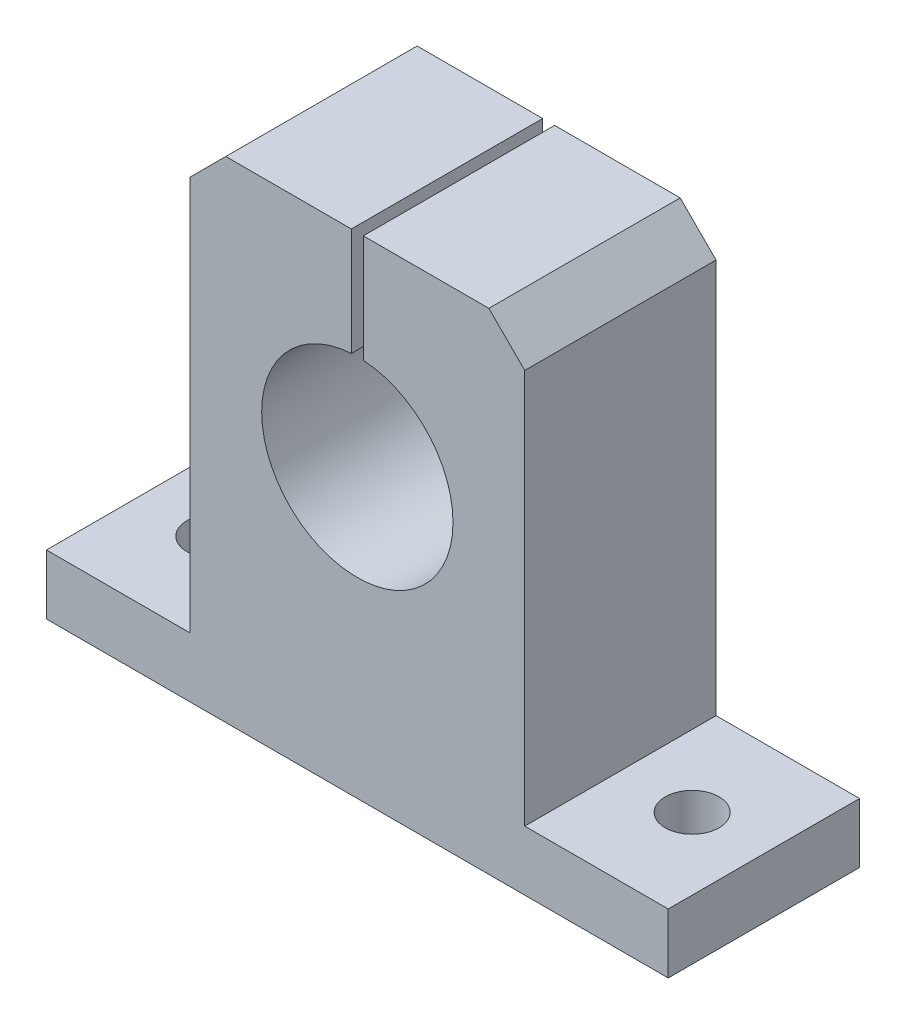
ISO-10303-21;
HEADER;
FILE_DESCRIPTION(('STEP AP214'),'2;1');
FILE_NAME('part.step','',(''),(''),'','','');
FILE_SCHEMA(('AUTOMOTIVE_DESIGN { 1 0 10303 214 1 1 1 1 }'));
ENDSEC;
DATA;
#1=APPLICATION_CONTEXT('core data for automotive mechanical design processes');
#2=APPLICATION_PROTOCOL_DEFINITION('international standard','automotive_design',2000,#1);
#3=PRODUCT_CONTEXT('',#1,'mechanical');
#4=PRODUCT('Part','Part','',(#3));
#5=PRODUCT_RELATED_PRODUCT_CATEGORY('part','',(#4));
#6=PRODUCT_DEFINITION_FORMATION('','',#4);
#7=PRODUCT_DEFINITION_CONTEXT('part definition',#1,'design');
#8=PRODUCT_DEFINITION('design','',#6,#7);
#9=PRODUCT_DEFINITION_SHAPE('','',#8);
#10=(LENGTH_UNIT() NAMED_UNIT(*) SI_UNIT(.MILLI.,.METRE.));
#11=(NAMED_UNIT(*) PLANE_ANGLE_UNIT() SI_UNIT($,.RADIAN.));
#12=(NAMED_UNIT(*) SI_UNIT($,.STERADIAN.) SOLID_ANGLE_UNIT());
#13=UNCERTAINTY_MEASURE_WITH_UNIT(LENGTH_MEASURE(1.E-05),#10,'distance_accuracy_value','');
#14=(GEOMETRIC_REPRESENTATION_CONTEXT(3) GLOBAL_UNCERTAINTY_ASSIGNED_CONTEXT((#13)) GLOBAL_UNIT_ASSIGNED_CONTEXT((#10,
#11,#12)) REPRESENTATION_CONTEXT('',''));
#15=CARTESIAN_POINT('',(0.,0.,0.));
#16=DIRECTION('',(0.,0.,1.));
#17=DIRECTION('',(1.,0.,0.));
#18=AXIS2_PLACEMENT_3D('',#15,#16,#17);
#19=CARTESIAN_POINT('',(41.275,-38.1,12.7));
#20=DIRECTION('',(0.,1.,0.));
#21=DIRECTION('',(-1.,0.,0.));
#22=AXIS2_PLACEMENT_3D('',#19,#20,#21);
#23=PLANE('',#22);
#24=DIRECTION('',(1.,0.,0.));
#25=VECTOR('',#24,1.);
#26=CARTESIAN_POINT('',(41.275,-38.1,-12.7));
#27=LINE('',#26,#25);
#28=CARTESIAN_POINT('',(-41.275,-38.1,-12.7));
#29=VERTEX_POINT('',#28);
#30=CARTESIAN_POINT('',(41.275,-38.1,-12.7));
#31=VERTEX_POINT('',#30);
#32=EDGE_CURVE('E170',#29,#31,#27,.T.);
#33=ORIENTED_EDGE('',*,*,#32,.T.);
#34=DIRECTION('',(0.,0.,-1.));
#35=VECTOR('',#34,1.);
#36=CARTESIAN_POINT('',(41.275,-38.1,12.7));
#37=LINE('',#36,#35);
#38=CARTESIAN_POINT('',(41.275,-38.1,12.7));
#39=VERTEX_POINT('',#38);
#40=EDGE_CURVE('E206',#39,#31,#37,.T.);
#41=ORIENTED_EDGE('',*,*,#40,.F.);
#42=DIRECTION('',(1.,0.,0.));
#43=VECTOR('',#42,1.);
#44=CARTESIAN_POINT('',(41.275,-38.1,12.7));
#45=LINE('',#44,#43);
#46=CARTESIAN_POINT('',(-41.275,-38.1,12.7));
#47=VERTEX_POINT('',#46);
#48=EDGE_CURVE('E194',#47,#39,#45,.T.);
#49=ORIENTED_EDGE('',*,*,#48,.F.);
#50=DIRECTION('',(0.,0.,-1.));
#51=VECTOR('',#50,1.);
#52=CARTESIAN_POINT('',(-41.275,-38.1,12.7));
#53=LINE('',#52,#51);
#54=EDGE_CURVE('E209',#47,#29,#53,.T.);
#55=ORIENTED_EDGE('',*,*,#54,.T.);
#56=EDGE_LOOP('',(#33,#41,#49,#55));
#57=FACE_BOUND('',#56,.T.);
#58=CARTESIAN_POINT('',(31.75,-38.1,0.));
#59=DIRECTION('',(0.,-1.,0.));
#60=DIRECTION('',(0.,0.,-1.));
#61=AXIS2_PLACEMENT_3D('',#58,#59,#60);
#62=CIRCLE('',#61,3.57124);
#63=CARTESIAN_POINT('',(31.75,-38.1,-3.57124));
#64=VERTEX_POINT('',#63);
#65=EDGE_CURVE('E266',#64,#64,#62,.T.);
#66=ORIENTED_EDGE('',*,*,#65,.F.);
#67=EDGE_LOOP('',(#66));
#68=FACE_BOUND('',#67,.T.);
#69=CARTESIAN_POINT('',(-31.75,-38.1,0.));
#70=DIRECTION('',(0.,-1.,0.));
#71=DIRECTION('',(0.,0.,-1.));
#72=AXIS2_PLACEMENT_3D('',#69,#70,#71);
#73=CIRCLE('',#72,3.57124);
#74=CARTESIAN_POINT('',(-31.75,-38.1,-3.57124));
#75=VERTEX_POINT('',#74);
#76=EDGE_CURVE('E274',#75,#75,#73,.T.);
#77=ORIENTED_EDGE('',*,*,#76,.F.);
#78=EDGE_LOOP('',(#77));
#79=FACE_BOUND('',#78,.T.);
#80=ADVANCED_FACE('F29',(#57,#68,#79),#23,.F.);
#81=CARTESIAN_POINT('',(22.225,26.9875,12.7));
#82=DIRECTION('',(-1.,0.,0.));
#83=DIRECTION('',(0.,-1.,0.));
#84=AXIS2_PLACEMENT_3D('',#81,#82,#83);
#85=PLANE('',#84);
#86=DIRECTION('',(0.,1.,0.));
#87=VECTOR('',#86,1.);
#88=CARTESIAN_POINT('',(22.225,26.9875,-12.7));
#89=LINE('',#88,#87);
#90=CARTESIAN_POINT('',(22.225,-30.1625,-12.7));
#91=VERTEX_POINT('',#90);
#92=CARTESIAN_POINT('',(22.225,22.225,-12.7));
#93=VERTEX_POINT('',#92);
#94=EDGE_CURVE('E140',#91,#93,#89,.T.);
#95=ORIENTED_EDGE('',*,*,#94,.T.);
#96=DIRECTION('',(0.,0.,1.));
#97=VECTOR('',#96,1.);
#98=CARTESIAN_POINT('',(22.225,22.225,12.7));
#99=LINE('',#98,#97);
#100=CARTESIAN_POINT('',(22.225,22.225,12.7));
#101=VERTEX_POINT('',#100);
#102=EDGE_CURVE('E11',#93,#101,#99,.T.);
#103=ORIENTED_EDGE('',*,*,#102,.T.);
#104=DIRECTION('',(0.,1.,0.));
#105=VECTOR('',#104,1.);
#106=CARTESIAN_POINT('',(22.225,26.9875,12.7));
#107=LINE('',#106,#105);
#108=CARTESIAN_POINT('',(22.225,-30.1625,12.7));
#109=VERTEX_POINT('',#108);
#110=EDGE_CURVE('E176',#109,#101,#107,.T.);
#111=ORIENTED_EDGE('',*,*,#110,.F.);
#112=DIRECTION('',(0.,0.,-1.));
#113=VECTOR('',#112,1.);
#114=CARTESIAN_POINT('',(22.225,-30.1625,12.7));
#115=LINE('',#114,#113);
#116=EDGE_CURVE('E200',#109,#91,#115,.T.);
#117=ORIENTED_EDGE('',*,*,#116,.T.);
#118=EDGE_LOOP('',(#95,#103,#111,#117));
#119=FACE_BOUND('',#118,.T.);
#120=ADVANCED_FACE('F31',(#119),#85,.F.);
#121=CARTESIAN_POINT('',(22.225,26.9875,12.7));
#122=DIRECTION('',(0.,-1.,0.));
#123=DIRECTION('',(0.,0.,-1.));
#124=AXIS2_PLACEMENT_3D('',#121,#122,#123);
#125=PLANE('',#124);
#126=DIRECTION('',(-1.,0.,0.));
#127=VECTOR('',#126,1.);
#128=CARTESIAN_POINT('',(22.225,26.9875,12.7));
#129=LINE('',#128,#127);
#130=CARTESIAN_POINT('',(17.4625,26.9875,12.7));
#131=VERTEX_POINT('',#130);
#132=CARTESIAN_POINT('',(0.793750000000026,26.9875,12.7));
#133=VERTEX_POINT('',#132);
#134=EDGE_CURVE('E178',#131,#133,#129,.T.);
#135=ORIENTED_EDGE('',*,*,#134,.F.);
#136=DIRECTION('',(0.,0.,-1.));
#137=VECTOR('',#136,1.);
#138=CARTESIAN_POINT('',(17.4625,26.9875,12.7));
#139=LINE('',#138,#137);
#140=CARTESIAN_POINT('',(17.4625,26.9875,-12.7));
#141=VERTEX_POINT('',#140);
#142=EDGE_CURVE('E37',#131,#141,#139,.T.);
#143=ORIENTED_EDGE('',*,*,#142,.T.);
#144=DIRECTION('',(-1.,0.,0.));
#145=VECTOR('',#144,1.);
#146=CARTESIAN_POINT('',(22.225,26.9875,-12.7));
#147=LINE('',#146,#145);
#148=CARTESIAN_POINT('',(0.793750000000026,26.9875,-12.7));
#149=VERTEX_POINT('',#148);
#150=EDGE_CURVE('E131',#141,#149,#147,.T.);
#151=ORIENTED_EDGE('',*,*,#150,.T.);
#152=DIRECTION('',(0.,0.,-1.));
#153=VECTOR('',#152,1.);
#154=CARTESIAN_POINT('',(0.793750000000026,26.9875,12.7));
#155=LINE('',#154,#153);
#156=EDGE_CURVE('E134',#133,#149,#155,.T.);
#157=ORIENTED_EDGE('',*,*,#156,.F.);
#158=EDGE_LOOP('',(#135,#143,#151,#157));
#159=FACE_BOUND('',#158,.T.);
#160=ADVANCED_FACE('F133',(#159),#125,.F.);
#161=CARTESIAN_POINT('',(0.793750000000026,26.9875,12.7));
#162=DIRECTION('',(1.,0.,0.));
#163=DIRECTION('',(0.,0.,-1.));
#164=AXIS2_PLACEMENT_3D('',#161,#162,#163);
#165=PLANE('',#164);
#166=DIRECTION('',(0.,-1.,0.));
#167=VECTOR('',#166,1.);
#168=CARTESIAN_POINT('',(0.793750000000026,26.9875,-12.7));
#169=LINE('',#168,#167);
#170=CARTESIAN_POINT('',(0.793750000000026,12.6751710417454,-12.7));
#171=VERTEX_POINT('',#170);
#172=EDGE_CURVE('E139',#149,#171,#169,.T.);
#173=ORIENTED_EDGE('',*,*,#172,.T.);
#174=DIRECTION('',(0.,0.,-1.));
#175=VECTOR('',#174,1.);
#176=CARTESIAN_POINT('',(0.793750000000026,12.6751710417454,12.7));
#177=LINE('',#176,#175);
#178=CARTESIAN_POINT('',(0.793750000000026,12.6751710417454,12.7));
#179=VERTEX_POINT('',#178);
#180=EDGE_CURVE('E148',#179,#171,#177,.T.);
#181=ORIENTED_EDGE('',*,*,#180,.F.);
#182=DIRECTION('',(0.,-1.,0.));
#183=VECTOR('',#182,1.);
#184=CARTESIAN_POINT('',(0.793750000000026,26.9875,12.7));
#185=LINE('',#184,#183);
#186=EDGE_CURVE('E146',#133,#179,#185,.T.);
#187=ORIENTED_EDGE('',*,*,#186,.F.);
#188=ORIENTED_EDGE('',*,*,#156,.T.);
#189=EDGE_LOOP('',(#173,#181,#187,#188));
#190=FACE_BOUND('',#189,.T.);
#191=ADVANCED_FACE('F143',(#190),#165,.F.);
#192=CARTESIAN_POINT('',(0.,0.,12.7));
#193=DIRECTION('',(0.,0.,-1.));
#194=DIRECTION('',(-1.,0.,0.));
#195=AXIS2_PLACEMENT_3D('',#192,#193,#194);
#196=CYLINDRICAL_SURFACE('',#195,12.7);
#197=CARTESIAN_POINT('',(0.,0.,-12.7));
#198=DIRECTION('',(0.,0.,-1.));
#199=DIRECTION('',(1.,0.,0.));
#200=AXIS2_PLACEMENT_3D('',#197,#198,#199);
#201=CIRCLE('',#200,12.7);
#202=CARTESIAN_POINT('',(-0.793749999999972,12.6751710417454,-12.7));
#203=VERTEX_POINT('',#202);
#204=EDGE_CURVE('E154',#171,#203,#201,.T.);
#205=ORIENTED_EDGE('',*,*,#204,.T.);
#206=DIRECTION('',(0.,0.,-1.));
#207=VECTOR('',#206,1.);
#208=CARTESIAN_POINT('',(-0.793749999999972,12.6751710417454,12.7));
#209=LINE('',#208,#207);
#210=CARTESIAN_POINT('',(-0.793749999999972,12.6751710417454,12.7));
#211=VERTEX_POINT('',#210);
#212=EDGE_CURVE('E221',#211,#203,#209,.T.);
#213=ORIENTED_EDGE('',*,*,#212,.F.);
#214=CARTESIAN_POINT('',(0.,0.,12.7));
#215=DIRECTION('',(0.,0.,-1.));
#216=DIRECTION('',(1.,0.,0.));
#217=AXIS2_PLACEMENT_3D('',#214,#215,#216);
#218=CIRCLE('',#217,12.7);
#219=EDGE_CURVE('E181',#179,#211,#218,.T.);
#220=ORIENTED_EDGE('',*,*,#219,.F.);
#221=ORIENTED_EDGE('',*,*,#180,.T.);
#222=EDGE_LOOP('',(#205,#213,#220,#221));
#223=FACE_BOUND('',#222,.T.);
#224=ADVANCED_FACE('F258',(#223),#196,.F.);
#225=CARTESIAN_POINT('',(-0.793749999999973,26.9875,12.7));
#226=DIRECTION('',(-1.,0.,0.));
#227=DIRECTION('',(0.,0.,1.));
#228=AXIS2_PLACEMENT_3D('',#225,#226,#227);
#229=PLANE('',#228);
#230=DIRECTION('',(0.,1.,0.));
#231=VECTOR('',#230,1.);
#232=CARTESIAN_POINT('',(-0.793749999999973,26.9875,-12.7));
#233=LINE('',#232,#231);
#234=CARTESIAN_POINT('',(-0.793749999999973,26.9875,-12.7));
#235=VERTEX_POINT('',#234);
#236=EDGE_CURVE('E156',#203,#235,#233,.T.);
#237=ORIENTED_EDGE('',*,*,#236,.T.);
#238=DIRECTION('',(0.,0.,-1.));
#239=VECTOR('',#238,1.);
#240=CARTESIAN_POINT('',(-0.793749999999973,26.9875,12.7));
#241=LINE('',#240,#239);
#242=CARTESIAN_POINT('',(-0.793749999999973,26.9875,12.7));
#243=VERTEX_POINT('',#242);
#244=EDGE_CURVE('E218',#243,#235,#241,.T.);
#245=ORIENTED_EDGE('',*,*,#244,.F.);
#246=DIRECTION('',(0.,1.,0.));
#247=VECTOR('',#246,1.);
#248=CARTESIAN_POINT('',(-0.793749999999973,26.9875,12.7));
#249=LINE('',#248,#247);
#250=EDGE_CURVE('E183',#211,#243,#249,.T.);
#251=ORIENTED_EDGE('',*,*,#250,.F.);
#252=ORIENTED_EDGE('',*,*,#212,.T.);
#253=EDGE_LOOP('',(#237,#245,#251,#252));
#254=FACE_BOUND('',#253,.T.);
#255=ADVANCED_FACE('F254',(#254),#229,.F.);
#256=CARTESIAN_POINT('',(-22.225,26.9875,12.7));
#257=DIRECTION('',(0.,-1.,0.));
#258=DIRECTION('',(0.,0.,-1.));
#259=AXIS2_PLACEMENT_3D('',#256,#257,#258);
#260=PLANE('',#259);
#261=DIRECTION('',(-1.,0.,0.));
#262=VECTOR('',#261,1.);
#263=CARTESIAN_POINT('',(-22.225,26.9875,-12.7));
#264=LINE('',#263,#262);
#265=CARTESIAN_POINT('',(-17.4625,26.9875,-12.7));
#266=VERTEX_POINT('',#265);
#267=EDGE_CURVE('E161',#235,#266,#264,.T.);
#268=ORIENTED_EDGE('',*,*,#267,.T.);
#269=DIRECTION('',(0.,0.,1.));
#270=VECTOR('',#269,1.);
#271=CARTESIAN_POINT('',(-17.4625,26.9875,12.7));
#272=LINE('',#271,#270);
#273=CARTESIAN_POINT('',(-17.4625,26.9875,12.7));
#274=VERTEX_POINT('',#273);
#275=EDGE_CURVE('E231',#266,#274,#272,.T.);
#276=ORIENTED_EDGE('',*,*,#275,.T.);
#277=DIRECTION('',(-1.,0.,0.));
#278=VECTOR('',#277,1.);
#279=CARTESIAN_POINT('',(-22.225,26.9875,12.7));
#280=LINE('',#279,#278);
#281=EDGE_CURVE('E185',#243,#274,#280,.T.);
#282=ORIENTED_EDGE('',*,*,#281,.F.);
#283=ORIENTED_EDGE('',*,*,#244,.T.);
#284=EDGE_LOOP('',(#268,#276,#282,#283));
#285=FACE_BOUND('',#284,.T.);
#286=ADVANCED_FACE('F250',(#285),#260,.F.);
#287=CARTESIAN_POINT('',(-22.225,-30.1625,12.7));
#288=DIRECTION('',(1.,0.,0.));
#289=DIRECTION('',(0.,1.,0.));
#290=AXIS2_PLACEMENT_3D('',#287,#288,#289);
#291=PLANE('',#290);
#292=DIRECTION('',(0.,-1.,0.));
#293=VECTOR('',#292,1.);
#294=CARTESIAN_POINT('',(-22.225,-30.1625,12.7));
#295=LINE('',#294,#293);
#296=CARTESIAN_POINT('',(-22.225,22.225,12.7));
#297=VERTEX_POINT('',#296);
#298=CARTESIAN_POINT('',(-22.225,-30.1625,12.7));
#299=VERTEX_POINT('',#298);
#300=EDGE_CURVE('E188',#297,#299,#295,.T.);
#301=ORIENTED_EDGE('',*,*,#300,.F.);
#302=DIRECTION('',(0.,0.,-1.));
#303=VECTOR('',#302,1.);
#304=CARTESIAN_POINT('',(-22.225,22.225,12.7));
#305=LINE('',#304,#303);
#306=CARTESIAN_POINT('',(-22.225,22.225,-12.7));
#307=VERTEX_POINT('',#306);
#308=EDGE_CURVE('E147',#297,#307,#305,.T.);
#309=ORIENTED_EDGE('',*,*,#308,.T.);
#310=DIRECTION('',(0.,-1.,0.));
#311=VECTOR('',#310,1.);
#312=CARTESIAN_POINT('',(-22.225,-30.1625,-12.7));
#313=LINE('',#312,#311);
#314=CARTESIAN_POINT('',(-22.225,-30.1625,-12.7));
#315=VERTEX_POINT('',#314);
#316=EDGE_CURVE('E164',#307,#315,#313,.T.);
#317=ORIENTED_EDGE('',*,*,#316,.T.);
#318=DIRECTION('',(0.,0.,-1.));
#319=VECTOR('',#318,1.);
#320=CARTESIAN_POINT('',(-22.225,-30.1625,12.7));
#321=LINE('',#320,#319);
#322=EDGE_CURVE('E215',#299,#315,#321,.T.);
#323=ORIENTED_EDGE('',*,*,#322,.F.);
#324=EDGE_LOOP('',(#301,#309,#317,#323));
#325=FACE_BOUND('',#324,.T.);
#326=ADVANCED_FACE('F244',(#325),#291,.F.);
#327=CARTESIAN_POINT('',(-41.275,-30.1625,12.7));
#328=DIRECTION('',(0.,-1.,0.));
#329=DIRECTION('',(0.,0.,-1.));
#330=AXIS2_PLACEMENT_3D('',#327,#328,#329);
#331=PLANE('',#330);
#332=CARTESIAN_POINT('',(-31.75,-30.1625,0.));
#333=DIRECTION('',(0.,-1.,0.));
#334=DIRECTION('',(0.,0.,-1.));
#335=AXIS2_PLACEMENT_3D('',#332,#333,#334);
#336=CIRCLE('',#335,3.57124);
#337=CARTESIAN_POINT('',(-31.75,-30.1625,-3.57124));
#338=VERTEX_POINT('',#337);
#339=EDGE_CURVE('E271',#338,#338,#336,.T.);
#340=ORIENTED_EDGE('',*,*,#339,.T.);
#341=EDGE_LOOP('',(#340));
#342=FACE_BOUND('',#341,.T.);
#343=DIRECTION('',(-1.,0.,0.));
#344=VECTOR('',#343,1.);
#345=CARTESIAN_POINT('',(-41.275,-30.1625,-12.7));
#346=LINE('',#345,#344);
#347=CARTESIAN_POINT('',(-41.275,-30.1625,-12.7));
#348=VERTEX_POINT('',#347);
#349=EDGE_CURVE('E166',#315,#348,#346,.T.);
#350=ORIENTED_EDGE('',*,*,#349,.T.);
#351=DIRECTION('',(0.,0.,-1.));
#352=VECTOR('',#351,1.);
#353=CARTESIAN_POINT('',(-41.275,-30.1625,12.7));
#354=LINE('',#353,#352);
#355=CARTESIAN_POINT('',(-41.275,-30.1625,12.7));
#356=VERTEX_POINT('',#355);
#357=EDGE_CURVE('E212',#356,#348,#354,.T.);
#358=ORIENTED_EDGE('',*,*,#357,.F.);
#359=DIRECTION('',(-1.,0.,0.));
#360=VECTOR('',#359,1.);
#361=CARTESIAN_POINT('',(-41.275,-30.1625,12.7));
#362=LINE('',#361,#360);
#363=EDGE_CURVE('E190',#299,#356,#362,.T.);
#364=ORIENTED_EDGE('',*,*,#363,.F.);
#365=ORIENTED_EDGE('',*,*,#322,.T.);
#366=EDGE_LOOP('',(#350,#358,#364,#365));
#367=FACE_BOUND('',#366,.T.);
#368=ADVANCED_FACE('F296',(#342,#367),#331,.F.);
#369=CARTESIAN_POINT('',(-41.275,-38.1,12.7));
#370=DIRECTION('',(1.,0.,0.));
#371=DIRECTION('',(0.,1.,0.));
#372=AXIS2_PLACEMENT_3D('',#369,#370,#371);
#373=PLANE('',#372);
#374=DIRECTION('',(0.,-1.,0.));
#375=VECTOR('',#374,1.);
#376=CARTESIAN_POINT('',(-41.275,-38.1,-12.7));
#377=LINE('',#376,#375);
#378=EDGE_CURVE('E168',#348,#29,#377,.T.);
#379=ORIENTED_EDGE('',*,*,#378,.T.);
#380=ORIENTED_EDGE('',*,*,#54,.F.);
#381=DIRECTION('',(0.,-1.,0.));
#382=VECTOR('',#381,1.);
#383=CARTESIAN_POINT('',(-41.275,-38.1,12.7));
#384=LINE('',#383,#382);
#385=EDGE_CURVE('E192',#356,#47,#384,.T.);
#386=ORIENTED_EDGE('',*,*,#385,.F.);
#387=ORIENTED_EDGE('',*,*,#357,.T.);
#388=EDGE_LOOP('',(#379,#380,#386,#387));
#389=FACE_BOUND('',#388,.T.);
#390=ADVANCED_FACE('F293',(#389),#373,.F.);
#391=CARTESIAN_POINT('',(41.275,-30.1625,12.7));
#392=DIRECTION('',(-1.,0.,0.));
#393=DIRECTION('',(0.,-1.,0.));
#394=AXIS2_PLACEMENT_3D('',#391,#392,#393);
#395=PLANE('',#394);
#396=DIRECTION('',(0.,1.,0.));
#397=VECTOR('',#396,1.);
#398=CARTESIAN_POINT('',(41.275,-30.1625,-12.7));
#399=LINE('',#398,#397);
#400=CARTESIAN_POINT('',(41.275,-30.1625,-12.7));
#401=VERTEX_POINT('',#400);
#402=EDGE_CURVE('E172',#31,#401,#399,.T.);
#403=ORIENTED_EDGE('',*,*,#402,.T.);
#404=DIRECTION('',(0.,0.,-1.));
#405=VECTOR('',#404,1.);
#406=CARTESIAN_POINT('',(41.275,-30.1625,12.7));
#407=LINE('',#406,#405);
#408=CARTESIAN_POINT('',(41.275,-30.1625,12.7));
#409=VERTEX_POINT('',#408);
#410=EDGE_CURVE('E203',#409,#401,#407,.T.);
#411=ORIENTED_EDGE('',*,*,#410,.F.);
#412=DIRECTION('',(0.,1.,0.));
#413=VECTOR('',#412,1.);
#414=CARTESIAN_POINT('',(41.275,-30.1625,12.7));
#415=LINE('',#414,#413);
#416=EDGE_CURVE('E196',#39,#409,#415,.T.);
#417=ORIENTED_EDGE('',*,*,#416,.F.);
#418=ORIENTED_EDGE('',*,*,#40,.T.);
#419=EDGE_LOOP('',(#403,#411,#417,#418));
#420=FACE_BOUND('',#419,.T.);
#421=ADVANCED_FACE('F291',(#420),#395,.F.);
#422=CARTESIAN_POINT('',(22.225,-30.1625,12.7));
#423=DIRECTION('',(0.,-1.,0.));
#424=DIRECTION('',(0.,0.,-1.));
#425=AXIS2_PLACEMENT_3D('',#422,#423,#424);
#426=PLANE('',#425);
#427=CARTESIAN_POINT('',(31.75,-30.1625,0.));
#428=DIRECTION('',(0.,-1.,0.));
#429=DIRECTION('',(0.,0.,-1.));
#430=AXIS2_PLACEMENT_3D('',#427,#428,#429);
#431=CIRCLE('',#430,3.57124);
#432=CARTESIAN_POINT('',(31.75,-30.1625,-3.57124));
#433=VERTEX_POINT('',#432);
#434=EDGE_CURVE('E264',#433,#433,#431,.T.);
#435=ORIENTED_EDGE('',*,*,#434,.T.);
#436=EDGE_LOOP('',(#435));
#437=FACE_BOUND('',#436,.T.);
#438=DIRECTION('',(-1.,0.,0.));
#439=VECTOR('',#438,1.);
#440=CARTESIAN_POINT('',(22.225,-30.1625,-12.7));
#441=LINE('',#440,#439);
#442=EDGE_CURVE('E174',#401,#91,#441,.T.);
#443=ORIENTED_EDGE('',*,*,#442,.T.);
#444=ORIENTED_EDGE('',*,*,#116,.F.);
#445=DIRECTION('',(-1.,0.,0.));
#446=VECTOR('',#445,1.);
#447=CARTESIAN_POINT('',(22.225,-30.1625,12.7));
#448=LINE('',#447,#446);
#449=EDGE_CURVE('E198',#409,#109,#448,.T.);
#450=ORIENTED_EDGE('',*,*,#449,.F.);
#451=ORIENTED_EDGE('',*,*,#410,.T.);
#452=EDGE_LOOP('',(#443,#444,#450,#451));
#453=FACE_BOUND('',#452,.T.);
#454=ADVANCED_FACE('F332',(#437,#453),#426,.F.);
#455=CARTESIAN_POINT('',(0.,0.,12.7));
#456=DIRECTION('',(0.,0.,1.));
#457=DIRECTION('',(1.,0.,0.));
#458=AXIS2_PLACEMENT_3D('',#455,#456,#457);
#459=PLANE('',#458);
#460=ORIENTED_EDGE('',*,*,#281,.T.);
#461=DIRECTION('',(0.707106781186549,0.707106781186547,0.));
#462=VECTOR('',#461,1.);
#463=CARTESIAN_POINT('',(-22.225,22.225,12.7));
#464=LINE('',#463,#462);
#465=EDGE_CURVE('E234',#274,#297,#464,.F.);
#466=ORIENTED_EDGE('',*,*,#465,.T.);
#467=ORIENTED_EDGE('',*,*,#300,.T.);
#468=ORIENTED_EDGE('',*,*,#363,.T.);
#469=ORIENTED_EDGE('',*,*,#385,.T.);
#470=ORIENTED_EDGE('',*,*,#48,.T.);
#471=ORIENTED_EDGE('',*,*,#416,.T.);
#472=ORIENTED_EDGE('',*,*,#449,.T.);
#473=ORIENTED_EDGE('',*,*,#110,.T.);
#474=DIRECTION('',(0.707106781186545,-0.70710678118655,0.));
#475=VECTOR('',#474,1.);
#476=CARTESIAN_POINT('',(22.225,22.2249999999999,12.7));
#477=LINE('',#476,#475);
#478=EDGE_CURVE('E44',#101,#131,#477,.F.);
#479=ORIENTED_EDGE('',*,*,#478,.T.);
#480=ORIENTED_EDGE('',*,*,#134,.T.);
#481=ORIENTED_EDGE('',*,*,#186,.T.);
#482=ORIENTED_EDGE('',*,*,#219,.T.);
#483=ORIENTED_EDGE('',*,*,#250,.T.);
#484=EDGE_LOOP('',(#460,#466,#467,#468,#469,#470,#471,#472,#473,#479,#480,#481,#482,#483));
#485=FACE_BOUND('',#484,.T.);
#486=ADVANCED_FACE('F237',(#485),#459,.T.);
#487=CARTESIAN_POINT('',(0.,0.,-12.7));
#488=DIRECTION('',(0.,0.,1.));
#489=DIRECTION('',(1.,0.,0.));
#490=AXIS2_PLACEMENT_3D('',#487,#488,#489);
#491=PLANE('',#490);
#492=ORIENTED_EDGE('',*,*,#316,.F.);
#493=DIRECTION('',(-0.707106781186549,-0.707106781186547,0.));
#494=VECTOR('',#493,1.);
#495=CARTESIAN_POINT('',(-22.225,22.225,-12.7));
#496=LINE('',#495,#494);
#497=EDGE_CURVE('E229',#307,#266,#496,.F.);
#498=ORIENTED_EDGE('',*,*,#497,.T.);
#499=ORIENTED_EDGE('',*,*,#267,.F.);
#500=ORIENTED_EDGE('',*,*,#236,.F.);
#501=ORIENTED_EDGE('',*,*,#204,.F.);
#502=ORIENTED_EDGE('',*,*,#172,.F.);
#503=ORIENTED_EDGE('',*,*,#150,.F.);
#504=DIRECTION('',(-0.707106781186545,0.70710678118655,0.));
#505=VECTOR('',#504,1.);
#506=CARTESIAN_POINT('',(17.4625,26.9875,-12.7));
#507=LINE('',#506,#505);
#508=EDGE_CURVE('E227',#141,#93,#507,.F.);
#509=ORIENTED_EDGE('',*,*,#508,.T.);
#510=ORIENTED_EDGE('',*,*,#94,.F.);
#511=ORIENTED_EDGE('',*,*,#442,.F.);
#512=ORIENTED_EDGE('',*,*,#402,.F.);
#513=ORIENTED_EDGE('',*,*,#32,.F.);
#514=ORIENTED_EDGE('',*,*,#378,.F.);
#515=ORIENTED_EDGE('',*,*,#349,.F.);
#516=EDGE_LOOP('',(#492,#498,#499,#500,#501,#502,#503,#509,#510,#511,#512,#513,#514,#515));
#517=FACE_BOUND('',#516,.T.);
#518=ADVANCED_FACE('F152',(#517),#491,.F.);
#519=CARTESIAN_POINT('',(31.75,-38.1,0.));
#520=DIRECTION('',(0.,-1.,0.));
#521=DIRECTION('',(0.,0.,-1.));
#522=AXIS2_PLACEMENT_3D('',#519,#520,#521);
#523=CYLINDRICAL_SURFACE('',#522,3.57124);
#524=ORIENTED_EDGE('',*,*,#434,.F.);
#525=EDGE_LOOP('',(#524));
#526=FACE_BOUND('',#525,.T.);
#527=ORIENTED_EDGE('',*,*,#65,.T.);
#528=EDGE_LOOP('',(#527));
#529=FACE_BOUND('',#528,.T.);
#530=ADVANCED_FACE('F340',(#526,#529),#523,.F.);
#531=CARTESIAN_POINT('',(-31.75,-38.1,0.));
#532=DIRECTION('',(0.,-1.,0.));
#533=DIRECTION('',(0.,0.,-1.));
#534=AXIS2_PLACEMENT_3D('',#531,#532,#533);
#535=CYLINDRICAL_SURFACE('',#534,3.57124);
#536=ORIENTED_EDGE('',*,*,#339,.F.);
#537=EDGE_LOOP('',(#536));
#538=FACE_BOUND('',#537,.T.);
#539=ORIENTED_EDGE('',*,*,#76,.T.);
#540=EDGE_LOOP('',(#539));
#541=FACE_BOUND('',#540,.T.);
#542=ADVANCED_FACE('F278',(#538,#541),#535,.F.);
#543=CARTESIAN_POINT('',(-22.225,22.225,12.7));
#544=DIRECTION('',(0.707106781186547,-0.707106781186549,0.));
#545=DIRECTION('',(0.707106781186549,0.707106781186547,0.));
#546=AXIS2_PLACEMENT_3D('',#543,#544,#545);
#547=PLANE('',#546);
#548=ORIENTED_EDGE('',*,*,#465,.F.);
#549=ORIENTED_EDGE('',*,*,#275,.F.);
#550=ORIENTED_EDGE('',*,*,#497,.F.);
#551=ORIENTED_EDGE('',*,*,#308,.F.);
#552=EDGE_LOOP('',(#548,#549,#550,#551));
#553=FACE_BOUND('',#552,.T.);
#554=ADVANCED_FACE('F246',(#553),#547,.F.);
#555=CARTESIAN_POINT('',(17.4625,26.9875,12.7));
#556=DIRECTION('',(-0.70710678118655,-0.707106781186545,0.));
#557=DIRECTION('',(0.707106781186545,-0.70710678118655,0.));
#558=AXIS2_PLACEMENT_3D('',#555,#556,#557);
#559=PLANE('',#558);
#560=ORIENTED_EDGE('',*,*,#478,.F.);
#561=ORIENTED_EDGE('',*,*,#102,.F.);
#562=ORIENTED_EDGE('',*,*,#508,.F.);
#563=ORIENTED_EDGE('',*,*,#142,.F.);
#564=EDGE_LOOP('',(#560,#561,#562,#563));
#565=FACE_BOUND('',#564,.T.);
#566=ADVANCED_FACE('F260',(#565),#559,.F.);
#567=CLOSED_SHELL('',(#80,#120,#160,#191,#224,#255,#286,#326,#368,#390,#421,#454,#486,#518,#530,
#542,#554,#566));
#568=MANIFOLD_SOLID_BREP('B2',#567);
#569=ADVANCED_BREP_SHAPE_REPRESENTATION('',(#18,#568),#14);
#570=SHAPE_DEFINITION_REPRESENTATION(#9,#569);
ENDSEC;
END-ISO-10303-21;
